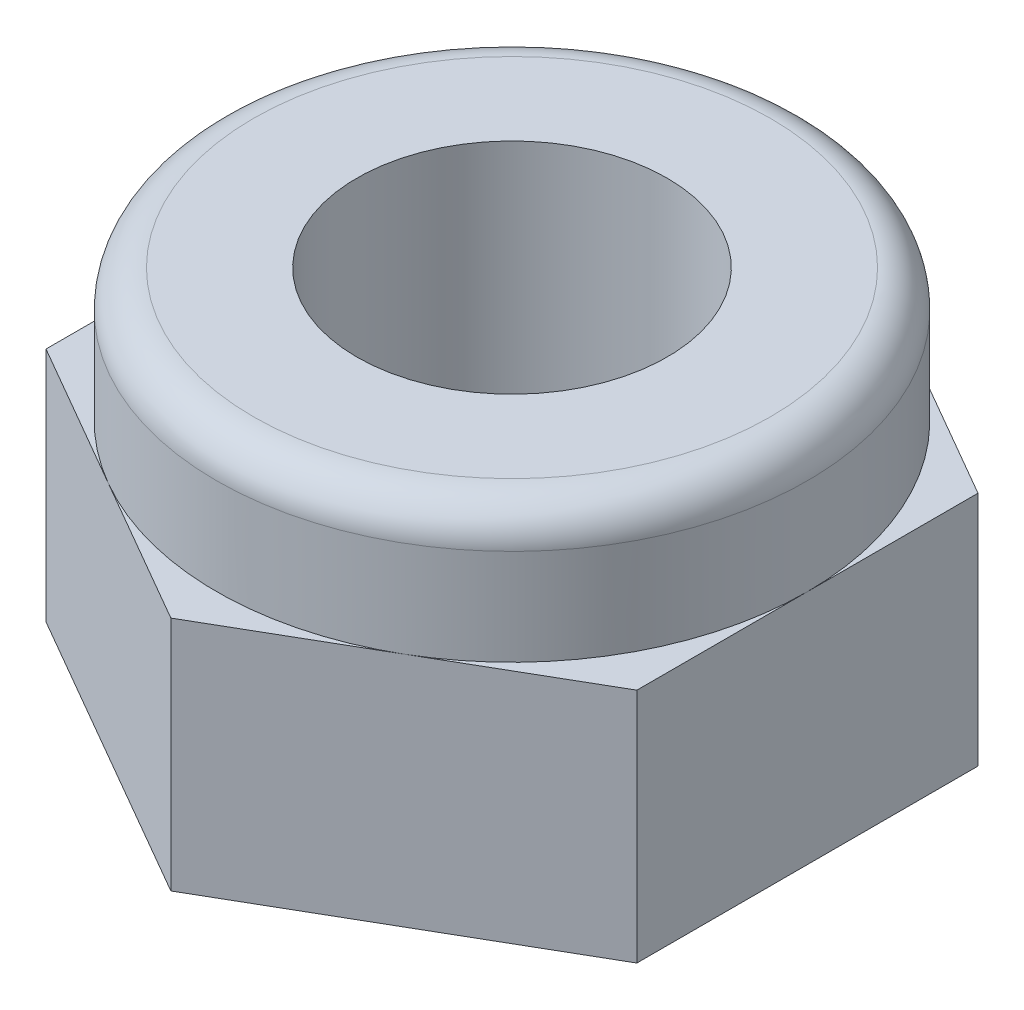
ISO-10303-21;
HEADER;
FILE_DESCRIPTION(('STEP AP214'),'2;1');
FILE_NAME('part.step','',(''),(''),'','','');
FILE_SCHEMA(('AUTOMOTIVE_DESIGN { 1 0 10303 214 1 1 1 1 }'));
ENDSEC;
DATA;
#1=APPLICATION_CONTEXT('core data for automotive mechanical design processes');
#2=APPLICATION_PROTOCOL_DEFINITION('international standard','automotive_design',2000,#1);
#3=PRODUCT_CONTEXT('',#1,'mechanical');
#4=PRODUCT('Part','Part','',(#3));
#5=PRODUCT_RELATED_PRODUCT_CATEGORY('part','',(#4));
#6=PRODUCT_DEFINITION_FORMATION('','',#4);
#7=PRODUCT_DEFINITION_CONTEXT('part definition',#1,'design');
#8=PRODUCT_DEFINITION('design','',#6,#7);
#9=PRODUCT_DEFINITION_SHAPE('','',#8);
#10=(LENGTH_UNIT() NAMED_UNIT(*) SI_UNIT(.MILLI.,.METRE.));
#11=(NAMED_UNIT(*) PLANE_ANGLE_UNIT() SI_UNIT($,.RADIAN.));
#12=(NAMED_UNIT(*) SI_UNIT($,.STERADIAN.) SOLID_ANGLE_UNIT());
#13=UNCERTAINTY_MEASURE_WITH_UNIT(LENGTH_MEASURE(1.E-05),#10,'distance_accuracy_value','');
#14=(GEOMETRIC_REPRESENTATION_CONTEXT(3) GLOBAL_UNCERTAINTY_ASSIGNED_CONTEXT((#13)) GLOBAL_UNIT_ASSIGNED_CONTEXT((#10,
#11,#12)) REPRESENTATION_CONTEXT('',''));
#15=CARTESIAN_POINT('',(0.,0.,0.));
#16=DIRECTION('',(0.,0.,1.));
#17=DIRECTION('',(1.,0.,0.));
#18=AXIS2_PLACEMENT_3D('',#15,#16,#17);
#19=CARTESIAN_POINT('',(0.,3.2,0.));
#20=DIRECTION('',(0.,1.,0.));
#21=DIRECTION('',(0.,0.,1.));
#22=AXIS2_PLACEMENT_3D('',#19,#20,#21);
#23=PLANE('',#22);
#24=CARTESIAN_POINT('',(0.,3.2,0.));
#25=DIRECTION('',(0.,1.,0.));
#26=DIRECTION('',(0.,0.,1.));
#27=AXIS2_PLACEMENT_3D('',#24,#25,#26);
#28=CIRCLE('',#27,4.00000000000001);
#29=CARTESIAN_POINT('',(2.00000000000003,3.2,3.46410161513774));
#30=VERTEX_POINT('',#29);
#31=CARTESIAN_POINT('',(3.99999999999999,3.2,0.));
#32=VERTEX_POINT('',#31);
#33=EDGE_CURVE('E135',#30,#32,#28,.T.);
#34=ORIENTED_EDGE('',*,*,#33,.F.);
#35=DIRECTION('',(0.866025403784435,0.,-0.500000000000007));
#36=VECTOR('',#35,1.);
#37=CARTESIAN_POINT('',(0.,3.2,4.618802153517));
#38=LINE('',#37,#36);
#39=CARTESIAN_POINT('',(4.00000000000002,3.2,2.30940107675846));
#40=VERTEX_POINT('',#39);
#41=EDGE_CURVE('E123',#30,#40,#38,.T.);
#42=ORIENTED_EDGE('',*,*,#41,.T.);
#43=DIRECTION('',(0.,0.,-1.));
#44=VECTOR('',#43,1.);
#45=CARTESIAN_POINT('',(4.00000000000002,3.2,2.30940107675846));
#46=LINE('',#45,#44);
#47=EDGE_CURVE('E136',#40,#32,#46,.T.);
#48=ORIENTED_EDGE('',*,*,#47,.T.);
#49=EDGE_LOOP('',(#34,#42,#48));
#50=FACE_BOUND('',#49,.T.);
#51=ADVANCED_FACE('F45',(#50),#23,.T.);
#52=CARTESIAN_POINT('',(1.99999999999998,3.2,-3.46410161513777));
#53=VERTEX_POINT('',#52);
#54=EDGE_CURVE('E60',#32,#53,#28,.T.);
#55=ORIENTED_EDGE('',*,*,#54,.F.);
#56=CARTESIAN_POINT('',(3.99999999999997,3.2,-2.30940107675855));
#57=VERTEX_POINT('',#56);
#58=EDGE_CURVE('E122',#32,#57,#46,.T.);
#59=ORIENTED_EDGE('',*,*,#58,.T.);
#60=DIRECTION('',(-0.866025403784442,0.,-0.499999999999995));
#61=VECTOR('',#60,1.);
#62=CARTESIAN_POINT('',(3.99999999999997,3.2,-2.30940107675855));
#63=LINE('',#62,#61);
#64=EDGE_CURVE('E153',#57,#53,#63,.T.);
#65=ORIENTED_EDGE('',*,*,#64,.T.);
#66=EDGE_LOOP('',(#55,#59,#65));
#67=FACE_BOUND('',#66,.T.);
#68=ADVANCED_FACE('F209',(#67),#23,.T.);
#69=CARTESIAN_POINT('',(-2.,3.2,-3.46410161513775));
#70=VERTEX_POINT('',#69);
#71=EDGE_CURVE('E192',#53,#70,#28,.T.);
#72=ORIENTED_EDGE('',*,*,#71,.F.);
#73=CARTESIAN_POINT('',(0.,3.2,-4.618802153517));
#74=VERTEX_POINT('',#73);
#75=EDGE_CURVE('E156',#53,#74,#63,.T.);
#76=ORIENTED_EDGE('',*,*,#75,.T.);
#77=DIRECTION('',(-0.866025403784438,0.,0.500000000000001));
#78=VECTOR('',#77,1.);
#79=CARTESIAN_POINT('',(0.,3.2,-4.618802153517));
#80=LINE('',#79,#78);
#81=EDGE_CURVE('E157',#74,#70,#80,.T.);
#82=ORIENTED_EDGE('',*,*,#81,.T.);
#83=EDGE_LOOP('',(#72,#76,#82));
#84=FACE_BOUND('',#83,.T.);
#85=ADVANCED_FACE('F204',(#84),#23,.T.);
#86=CARTESIAN_POINT('',(-3.99999999999999,3.2,0.));
#87=VERTEX_POINT('',#86);
#88=EDGE_CURVE('E146',#70,#87,#28,.T.);
#89=ORIENTED_EDGE('',*,*,#88,.F.);
#90=CARTESIAN_POINT('',(-4.,3.2,-2.30940107675849));
#91=VERTEX_POINT('',#90);
#92=EDGE_CURVE('E155',#70,#91,#80,.T.);
#93=ORIENTED_EDGE('',*,*,#92,.T.);
#94=DIRECTION('',(0.,0.,1.));
#95=VECTOR('',#94,1.);
#96=CARTESIAN_POINT('',(-4.,3.2,-2.30940107675849));
#97=LINE('',#96,#95);
#98=EDGE_CURVE('E161',#91,#87,#97,.T.);
#99=ORIENTED_EDGE('',*,*,#98,.T.);
#100=EDGE_LOOP('',(#89,#93,#99));
#101=FACE_BOUND('',#100,.T.);
#102=ADVANCED_FACE('F196',(#101),#23,.T.);
#103=CARTESIAN_POINT('',(-1.99999999999998,3.2,3.46410161513776));
#104=VERTEX_POINT('',#103);
#105=EDGE_CURVE('E144',#87,#104,#28,.T.);
#106=ORIENTED_EDGE('',*,*,#105,.F.);
#107=CARTESIAN_POINT('',(-3.99999999999998,3.2,2.30940107675852));
#108=VERTEX_POINT('',#107);
#109=EDGE_CURVE('E160',#87,#108,#97,.T.);
#110=ORIENTED_EDGE('',*,*,#109,.T.);
#111=DIRECTION('',(0.866025403784441,0.,0.499999999999995));
#112=VECTOR('',#111,1.);
#113=CARTESIAN_POINT('',(-3.99999999999998,3.2,2.30940107675852));
#114=LINE('',#113,#112);
#115=EDGE_CURVE('E133',#108,#104,#114,.T.);
#116=ORIENTED_EDGE('',*,*,#115,.T.);
#117=EDGE_LOOP('',(#106,#110,#116));
#118=FACE_BOUND('',#117,.T.);
#119=ADVANCED_FACE('F226',(#118),#23,.T.);
#120=CARTESIAN_POINT('',(3.99999999999997,3.2,-2.30940107675855));
#121=DIRECTION('',(-0.499999999999995,0.,0.866025403784442));
#122=DIRECTION('',(0.866025403784442,0.,0.499999999999995));
#123=AXIS2_PLACEMENT_3D('',#120,#121,#122);
#124=PLANE('',#123);
#125=DIRECTION('',(-0.866025403784442,0.,-0.499999999999995));
#126=VECTOR('',#125,1.);
#127=CARTESIAN_POINT('',(3.99999999999997,0.,-2.30940107675855));
#128=LINE('',#127,#126);
#129=CARTESIAN_POINT('',(3.99999999999997,0.,-2.30940107675855));
#130=VERTEX_POINT('',#129);
#131=CARTESIAN_POINT('',(0.,0.,-4.618802153517));
#132=VERTEX_POINT('',#131);
#133=EDGE_CURVE('E138',#130,#132,#128,.T.);
#134=ORIENTED_EDGE('',*,*,#133,.T.);
#135=DIRECTION('',(0.,-1.,0.));
#136=VECTOR('',#135,1.);
#137=CARTESIAN_POINT('',(0.,3.2,-4.618802153517));
#138=LINE('',#137,#136);
#139=EDGE_CURVE('E145',#74,#132,#138,.T.);
#140=ORIENTED_EDGE('',*,*,#139,.F.);
#141=ORIENTED_EDGE('',*,*,#75,.F.);
#142=ORIENTED_EDGE('',*,*,#64,.F.);
#143=DIRECTION('',(0.,-1.,0.));
#144=VECTOR('',#143,1.);
#145=CARTESIAN_POINT('',(3.99999999999997,3.2,-2.30940107675855));
#146=LINE('',#145,#144);
#147=EDGE_CURVE('E167',#57,#130,#146,.T.);
#148=ORIENTED_EDGE('',*,*,#147,.T.);
#149=EDGE_LOOP('',(#134,#140,#141,#142,#148));
#150=FACE_BOUND('',#149,.T.);
#151=ADVANCED_FACE('F208',(#150),#124,.F.);
#152=CARTESIAN_POINT('',(0.,3.2,-4.618802153517));
#153=DIRECTION('',(0.500000000000001,0.,0.866025403784438));
#154=DIRECTION('',(0.866025403784438,0.,-0.500000000000001));
#155=AXIS2_PLACEMENT_3D('',#152,#153,#154);
#156=PLANE('',#155);
#157=DIRECTION('',(-0.866025403784438,0.,0.500000000000001));
#158=VECTOR('',#157,1.);
#159=CARTESIAN_POINT('',(0.,0.,-4.618802153517));
#160=LINE('',#159,#158);
#161=CARTESIAN_POINT('',(-4.,0.,-2.30940107675849));
#162=VERTEX_POINT('',#161);
#163=EDGE_CURVE('E170',#132,#162,#160,.T.);
#164=ORIENTED_EDGE('',*,*,#163,.T.);
#165=DIRECTION('',(0.,-1.,0.));
#166=VECTOR('',#165,1.);
#167=CARTESIAN_POINT('',(-4.,3.2,-2.30940107675849));
#168=LINE('',#167,#166);
#169=EDGE_CURVE('E148',#91,#162,#168,.T.);
#170=ORIENTED_EDGE('',*,*,#169,.F.);
#171=ORIENTED_EDGE('',*,*,#92,.F.);
#172=ORIENTED_EDGE('',*,*,#81,.F.);
#173=ORIENTED_EDGE('',*,*,#139,.T.);
#174=EDGE_LOOP('',(#164,#170,#171,#172,#173));
#175=FACE_BOUND('',#174,.T.);
#176=ADVANCED_FACE('F201',(#175),#156,.F.);
#177=CARTESIAN_POINT('',(-4.,3.2,-2.30940107675849));
#178=DIRECTION('',(1.,0.,0.));
#179=DIRECTION('',(0.,0.,-1.));
#180=AXIS2_PLACEMENT_3D('',#177,#178,#179);
#181=PLANE('',#180);
#182=DIRECTION('',(0.,0.,1.));
#183=VECTOR('',#182,1.);
#184=CARTESIAN_POINT('',(-4.,0.,-2.30940107675849));
#185=LINE('',#184,#183);
#186=CARTESIAN_POINT('',(-3.99999999999998,0.,2.30940107675852));
#187=VERTEX_POINT('',#186);
#188=EDGE_CURVE('E172',#162,#187,#185,.T.);
#189=ORIENTED_EDGE('',*,*,#188,.T.);
#190=DIRECTION('',(0.,-1.,0.));
#191=VECTOR('',#190,1.);
#192=CARTESIAN_POINT('',(-3.99999999999998,3.2,2.30940107675852));
#193=LINE('',#192,#191);
#194=EDGE_CURVE('E185',#108,#187,#193,.T.);
#195=ORIENTED_EDGE('',*,*,#194,.F.);
#196=ORIENTED_EDGE('',*,*,#109,.F.);
#197=ORIENTED_EDGE('',*,*,#98,.F.);
#198=ORIENTED_EDGE('',*,*,#169,.T.);
#199=EDGE_LOOP('',(#189,#195,#196,#197,#198));
#200=FACE_BOUND('',#199,.T.);
#201=ADVANCED_FACE('F221',(#200),#181,.F.);
#202=CARTESIAN_POINT('',(-3.99999999999998,3.2,2.30940107675852));
#203=DIRECTION('',(0.499999999999995,0.,-0.866025403784441));
#204=DIRECTION('',(-0.866025403784441,0.,-0.499999999999995));
#205=AXIS2_PLACEMENT_3D('',#202,#203,#204);
#206=PLANE('',#205);
#207=DIRECTION('',(0.866025403784441,0.,0.499999999999995));
#208=VECTOR('',#207,1.);
#209=CARTESIAN_POINT('',(-3.99999999999998,0.,2.30940107675852));
#210=LINE('',#209,#208);
#211=CARTESIAN_POINT('',(0.,0.,4.618802153517));
#212=VERTEX_POINT('',#211);
#213=EDGE_CURVE('E174',#187,#212,#210,.T.);
#214=ORIENTED_EDGE('',*,*,#213,.T.);
#215=DIRECTION('',(0.,-1.,0.));
#216=VECTOR('',#215,1.);
#217=CARTESIAN_POINT('',(0.,3.2,4.618802153517));
#218=LINE('',#217,#216);
#219=CARTESIAN_POINT('',(0.,3.2,4.618802153517));
#220=VERTEX_POINT('',#219);
#221=EDGE_CURVE('E183',#220,#212,#218,.T.);
#222=ORIENTED_EDGE('',*,*,#221,.F.);
#223=EDGE_CURVE('E118',#104,#220,#114,.T.);
#224=ORIENTED_EDGE('',*,*,#223,.F.);
#225=ORIENTED_EDGE('',*,*,#115,.F.);
#226=ORIENTED_EDGE('',*,*,#194,.T.);
#227=EDGE_LOOP('',(#214,#222,#224,#225,#226));
#228=FACE_BOUND('',#227,.T.);
#229=ADVANCED_FACE('F228',(#228),#206,.F.);
#230=CARTESIAN_POINT('',(0.,3.2,4.618802153517));
#231=DIRECTION('',(-0.500000000000007,0.,-0.866025403784435));
#232=DIRECTION('',(-0.866025403784435,0.,0.500000000000007));
#233=AXIS2_PLACEMENT_3D('',#230,#231,#232);
#234=PLANE('',#233);
#235=DIRECTION('',(0.866025403784435,0.,-0.500000000000007));
#236=VECTOR('',#235,1.);
#237=CARTESIAN_POINT('',(0.,0.,4.618802153517));
#238=LINE('',#237,#236);
#239=CARTESIAN_POINT('',(4.00000000000002,0.,2.30940107675846));
#240=VERTEX_POINT('',#239);
#241=EDGE_CURVE('E176',#212,#240,#238,.T.);
#242=ORIENTED_EDGE('',*,*,#241,.T.);
#243=DIRECTION('',(0.,-1.,0.));
#244=VECTOR('',#243,1.);
#245=CARTESIAN_POINT('',(4.00000000000002,3.2,2.30940107675846));
#246=LINE('',#245,#244);
#247=EDGE_CURVE('E129',#40,#240,#246,.T.);
#248=ORIENTED_EDGE('',*,*,#247,.F.);
#249=ORIENTED_EDGE('',*,*,#41,.F.);
#250=EDGE_CURVE('E115',#220,#30,#38,.T.);
#251=ORIENTED_EDGE('',*,*,#250,.F.);
#252=ORIENTED_EDGE('',*,*,#221,.T.);
#253=EDGE_LOOP('',(#242,#248,#249,#251,#252));
#254=FACE_BOUND('',#253,.T.);
#255=ADVANCED_FACE('F127',(#254),#234,.F.);
#256=CARTESIAN_POINT('',(4.00000000000002,3.2,2.30940107675846));
#257=DIRECTION('',(-1.,0.,0.));
#258=DIRECTION('',(0.,0.,1.));
#259=AXIS2_PLACEMENT_3D('',#256,#257,#258);
#260=PLANE('',#259);
#261=DIRECTION('',(0.,0.,-1.));
#262=VECTOR('',#261,1.);
#263=CARTESIAN_POINT('',(4.00000000000002,0.,2.30940107675846));
#264=LINE('',#263,#262);
#265=EDGE_CURVE('E178',#240,#130,#264,.T.);
#266=ORIENTED_EDGE('',*,*,#265,.T.);
#267=ORIENTED_EDGE('',*,*,#147,.F.);
#268=ORIENTED_EDGE('',*,*,#58,.F.);
#269=ORIENTED_EDGE('',*,*,#47,.F.);
#270=ORIENTED_EDGE('',*,*,#247,.T.);
#271=EDGE_LOOP('',(#266,#267,#268,#269,#270));
#272=FACE_BOUND('',#271,.T.);
#273=ADVANCED_FACE('F212',(#272),#260,.F.);
#274=EDGE_CURVE('E68',#104,#30,#28,.T.);
#275=ORIENTED_EDGE('',*,*,#274,.F.);
#276=ORIENTED_EDGE('',*,*,#223,.T.);
#277=ORIENTED_EDGE('',*,*,#250,.T.);
#278=EDGE_LOOP('',(#275,#276,#277));
#279=FACE_BOUND('',#278,.T.);
#280=ADVANCED_FACE('F117',(#279),#23,.T.);
#281=CARTESIAN_POINT('',(0.,0.,0.));
#282=DIRECTION('',(0.,1.,0.));
#283=DIRECTION('',(0.,0.,1.));
#284=AXIS2_PLACEMENT_3D('',#281,#282,#283);
#285=PLANE('',#284);
#286=CARTESIAN_POINT('',(0.,0.,0.));
#287=DIRECTION('',(0.,1.,0.));
#288=DIRECTION('',(0.,0.,1.));
#289=AXIS2_PLACEMENT_3D('',#286,#287,#288);
#290=CIRCLE('',#289,2.1);
#291=CARTESIAN_POINT('',(0.,0.,2.1));
#292=VERTEX_POINT('',#291);
#293=EDGE_CURVE('E139',#292,#292,#290,.T.);
#294=ORIENTED_EDGE('',*,*,#293,.T.);
#295=EDGE_LOOP('',(#294));
#296=FACE_BOUND('',#295,.T.);
#297=ORIENTED_EDGE('',*,*,#133,.F.);
#298=ORIENTED_EDGE('',*,*,#265,.F.);
#299=ORIENTED_EDGE('',*,*,#241,.F.);
#300=ORIENTED_EDGE('',*,*,#213,.F.);
#301=ORIENTED_EDGE('',*,*,#188,.F.);
#302=ORIENTED_EDGE('',*,*,#163,.F.);
#303=EDGE_LOOP('',(#297,#298,#299,#300,#301,#302));
#304=FACE_BOUND('',#303,.T.);
#305=ADVANCED_FACE('F216',(#296,#304),#285,.F.);
#306=CARTESIAN_POINT('',(0.,5.,0.));
#307=DIRECTION('',(0.,-1.,0.));
#308=DIRECTION('',(0.,0.,-1.));
#309=AXIS2_PLACEMENT_3D('',#306,#307,#308);
#310=CYLINDRICAL_SURFACE('',#309,4.00000000000001);
#311=CARTESIAN_POINT('',(0.,4.5,0.));
#312=DIRECTION('',(0.,1.,0.));
#313=DIRECTION('',(0.,0.,1.));
#314=AXIS2_PLACEMENT_3D('',#311,#312,#313);
#315=CIRCLE('',#314,4.00000000000001);
#316=CARTESIAN_POINT('',(0.,4.5,4.00000000000001));
#317=VERTEX_POINT('',#316);
#318=EDGE_CURVE('E11',#317,#317,#315,.F.);
#319=ORIENTED_EDGE('',*,*,#318,.T.);
#320=EDGE_LOOP('',(#319));
#321=FACE_BOUND('',#320,.T.);
#322=ORIENTED_EDGE('',*,*,#33,.T.);
#323=ORIENTED_EDGE('',*,*,#54,.T.);
#324=ORIENTED_EDGE('',*,*,#71,.T.);
#325=ORIENTED_EDGE('',*,*,#88,.T.);
#326=ORIENTED_EDGE('',*,*,#105,.T.);
#327=ORIENTED_EDGE('',*,*,#274,.T.);
#328=EDGE_LOOP('',(#322,#323,#324,#325,#326,#327));
#329=FACE_BOUND('',#328,.T.);
#330=ADVANCED_FACE('F142',(#321,#329),#310,.T.);
#331=CARTESIAN_POINT('',(0.,5.,0.));
#332=DIRECTION('',(0.,1.,0.));
#333=DIRECTION('',(0.,0.,1.));
#334=AXIS2_PLACEMENT_3D('',#331,#332,#333);
#335=PLANE('',#334);
#336=CARTESIAN_POINT('',(0.,5.,0.));
#337=DIRECTION('',(0.,1.,0.));
#338=DIRECTION('',(0.,0.,1.));
#339=AXIS2_PLACEMENT_3D('',#336,#337,#338);
#340=CIRCLE('',#339,2.1);
#341=CARTESIAN_POINT('',(0.,5.,2.1));
#342=VERTEX_POINT('',#341);
#343=EDGE_CURVE('E308',#342,#342,#340,.T.);
#344=ORIENTED_EDGE('',*,*,#343,.F.);
#345=EDGE_LOOP('',(#344));
#346=FACE_BOUND('',#345,.T.);
#347=CARTESIAN_POINT('',(0.,5.,0.));
#348=DIRECTION('',(0.,1.,0.));
#349=DIRECTION('',(0.,0.,1.));
#350=AXIS2_PLACEMENT_3D('',#347,#348,#349);
#351=CIRCLE('',#350,3.50000000000001);
#352=CARTESIAN_POINT('',(0.,5.,3.50000000000001));
#353=VERTEX_POINT('',#352);
#354=EDGE_CURVE('E53',#353,#353,#351,.T.);
#355=ORIENTED_EDGE('',*,*,#354,.T.);
#356=EDGE_LOOP('',(#355));
#357=FACE_BOUND('',#356,.T.);
#358=ADVANCED_FACE('F274',(#346,#357),#335,.T.);
#359=CARTESIAN_POINT('',(0.,4.5,0.));
#360=DIRECTION('',(0.,1.,0.));
#361=DIRECTION('',(0.,0.,1.));
#362=AXIS2_PLACEMENT_3D('',#359,#360,#361);
#363=TOROIDAL_SURFACE('',#362,3.50000000000001,0.5);
#364=ORIENTED_EDGE('',*,*,#318,.F.);
#365=EDGE_LOOP('',(#364));
#366=FACE_BOUND('',#365,.T.);
#367=ORIENTED_EDGE('',*,*,#354,.F.);
#368=EDGE_LOOP('',(#367));
#369=FACE_BOUND('',#368,.T.);
#370=ADVANCED_FACE('F47',(#366,#369),#363,.T.);
#371=CARTESIAN_POINT('',(0.,5.,0.));
#372=DIRECTION('',(0.,1.,0.));
#373=DIRECTION('',(0.,0.,1.));
#374=AXIS2_PLACEMENT_3D('',#371,#372,#373);
#375=CYLINDRICAL_SURFACE('',#374,2.1);
#376=ORIENTED_EDGE('',*,*,#293,.F.);
#377=EDGE_LOOP('',(#376));
#378=FACE_BOUND('',#377,.T.);
#379=ORIENTED_EDGE('',*,*,#343,.T.);
#380=EDGE_LOOP('',(#379));
#381=FACE_BOUND('',#380,.T.);
#382=ADVANCED_FACE('F289',(#378,#381),#375,.F.);
#383=CLOSED_SHELL('',(#51,#68,#85,#102,#119,#151,#176,#201,#229,#255,#273,#280,#305,#330,#358,
#370,#382));
#384=MANIFOLD_SOLID_BREP('B2',#383);
#385=ADVANCED_BREP_SHAPE_REPRESENTATION('',(#18,#384),#14);
#386=SHAPE_DEFINITION_REPRESENTATION(#9,#385);
ENDSEC;
END-ISO-10303-21;
